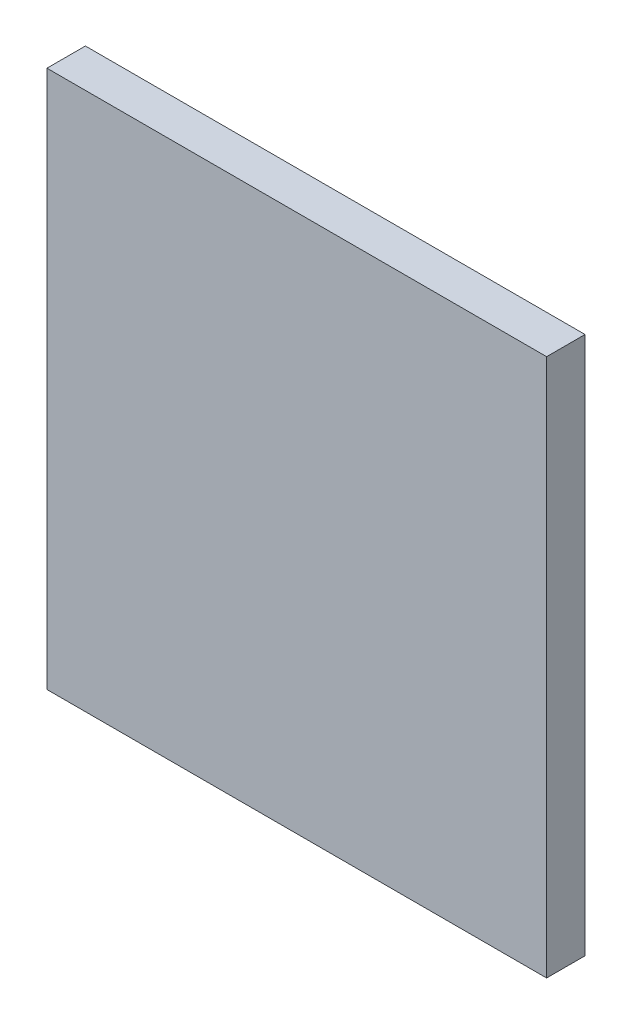
ISO-10303-21;
HEADER;
FILE_DESCRIPTION(('STEP AP214'),'2;1');
FILE_NAME('part.step','',(''),(''),'','','');
FILE_SCHEMA(('AUTOMOTIVE_DESIGN { 1 0 10303 214 1 1 1 1 }'));
ENDSEC;
DATA;
#1=APPLICATION_CONTEXT('core data for automotive mechanical design processes');
#2=APPLICATION_PROTOCOL_DEFINITION('international standard','automotive_design',2000,#1);
#3=PRODUCT_CONTEXT('',#1,'mechanical');
#4=PRODUCT('Part','Part','',(#3));
#5=PRODUCT_RELATED_PRODUCT_CATEGORY('part','',(#4));
#6=PRODUCT_DEFINITION_FORMATION('','',#4);
#7=PRODUCT_DEFINITION_CONTEXT('part definition',#1,'design');
#8=PRODUCT_DEFINITION('design','',#6,#7);
#9=PRODUCT_DEFINITION_SHAPE('','',#8);
#10=(LENGTH_UNIT() NAMED_UNIT(*) SI_UNIT(.MILLI.,.METRE.));
#11=(NAMED_UNIT(*) PLANE_ANGLE_UNIT() SI_UNIT($,.RADIAN.));
#12=(NAMED_UNIT(*) SI_UNIT($,.STERADIAN.) SOLID_ANGLE_UNIT());
#13=UNCERTAINTY_MEASURE_WITH_UNIT(LENGTH_MEASURE(1.E-05),#10,'distance_accuracy_value','');
#14=(GEOMETRIC_REPRESENTATION_CONTEXT(3) GLOBAL_UNCERTAINTY_ASSIGNED_CONTEXT((#13)) GLOBAL_UNIT_ASSIGNED_CONTEXT((#10,
#11,#12)) REPRESENTATION_CONTEXT('',''));
#15=CARTESIAN_POINT('',(0.,0.,0.));
#16=DIRECTION('',(0.,0.,1.));
#17=DIRECTION('',(1.,0.,0.));
#18=AXIS2_PLACEMENT_3D('',#15,#16,#17);
#19=CARTESIAN_POINT('',(-29.238417456991,23.8563829787234,5.));
#20=DIRECTION('',(1.,0.,0.));
#21=DIRECTION('',(0.,1.,0.));
#22=AXIS2_PLACEMENT_3D('',#19,#20,#21);
#23=PLANE('',#22);
#24=DIRECTION('',(0.,-1.,0.));
#25=VECTOR('',#24,1.);
#26=CARTESIAN_POINT('',(-29.238417456991,23.8563829787234,0.));
#27=LINE('',#26,#25);
#28=CARTESIAN_POINT('',(-29.238417456991,23.8563829787234,0.));
#29=VERTEX_POINT('',#28);
#30=CARTESIAN_POINT('',(-29.238417456991,-46.1436170212766,0.));
#31=VERTEX_POINT('',#30);
#32=EDGE_CURVE('E97',#29,#31,#27,.T.);
#33=ORIENTED_EDGE('',*,*,#32,.T.);
#34=DIRECTION('',(0.,0.,-1.));
#35=VECTOR('',#34,1.);
#36=CARTESIAN_POINT('',(-29.238417456991,-46.1436170212766,5.));
#37=LINE('',#36,#35);
#38=CARTESIAN_POINT('',(-29.238417456991,-46.1436170212766,5.));
#39=VERTEX_POINT('',#38);
#40=EDGE_CURVE('E11',#39,#31,#37,.T.);
#41=ORIENTED_EDGE('',*,*,#40,.F.);
#42=DIRECTION('',(0.,-1.,0.));
#43=VECTOR('',#42,1.);
#44=CARTESIAN_POINT('',(-29.238417456991,23.8563829787234,5.));
#45=LINE('',#44,#43);
#46=CARTESIAN_POINT('',(-29.238417456991,23.8563829787234,5.));
#47=VERTEX_POINT('',#46);
#48=EDGE_CURVE('E85',#47,#39,#45,.T.);
#49=ORIENTED_EDGE('',*,*,#48,.F.);
#50=DIRECTION('',(0.,0.,-1.));
#51=VECTOR('',#50,1.);
#52=CARTESIAN_POINT('',(-29.238417456991,23.8563829787234,5.));
#53=LINE('',#52,#51);
#54=EDGE_CURVE('E93',#47,#29,#53,.T.);
#55=ORIENTED_EDGE('',*,*,#54,.T.);
#56=EDGE_LOOP('',(#33,#41,#49,#55));
#57=FACE_BOUND('',#56,.T.);
#58=ADVANCED_FACE('F34',(#57),#23,.F.);
#59=CARTESIAN_POINT('',(-29.238417456991,-46.1436170212766,5.));
#60=DIRECTION('',(0.,1.,0.));
#61=DIRECTION('',(0.,0.,1.));
#62=AXIS2_PLACEMENT_3D('',#59,#60,#61);
#63=PLANE('',#62);
#64=DIRECTION('',(1.,0.,0.));
#65=VECTOR('',#64,1.);
#66=CARTESIAN_POINT('',(-29.238417456991,-46.1436170212766,0.));
#67=LINE('',#66,#65);
#68=CARTESIAN_POINT('',(35.761582543009,-46.1436170212766,0.));
#69=VERTEX_POINT('',#68);
#70=EDGE_CURVE('E89',#31,#69,#67,.T.);
#71=ORIENTED_EDGE('',*,*,#70,.T.);
#72=DIRECTION('',(0.,0.,-1.));
#73=VECTOR('',#72,1.);
#74=CARTESIAN_POINT('',(35.761582543009,-46.1436170212766,5.));
#75=LINE('',#74,#73);
#76=CARTESIAN_POINT('',(35.761582543009,-46.1436170212766,5.));
#77=VERTEX_POINT('',#76);
#78=EDGE_CURVE('E42',#77,#69,#75,.T.);
#79=ORIENTED_EDGE('',*,*,#78,.F.);
#80=DIRECTION('',(1.,0.,0.));
#81=VECTOR('',#80,1.);
#82=CARTESIAN_POINT('',(-29.238417456991,-46.1436170212766,5.));
#83=LINE('',#82,#81);
#84=EDGE_CURVE('E80',#39,#77,#83,.T.);
#85=ORIENTED_EDGE('',*,*,#84,.F.);
#86=ORIENTED_EDGE('',*,*,#40,.T.);
#87=EDGE_LOOP('',(#71,#79,#85,#86));
#88=FACE_BOUND('',#87,.T.);
#89=ADVANCED_FACE('F88',(#88),#63,.F.);
#90=CARTESIAN_POINT('',(35.761582543009,23.8563829787234,5.));
#91=DIRECTION('',(-1.,0.,0.));
#92=DIRECTION('',(0.,-1.,0.));
#93=AXIS2_PLACEMENT_3D('',#90,#91,#92);
#94=PLANE('',#93);
#95=DIRECTION('',(0.,1.,0.));
#96=VECTOR('',#95,1.);
#97=CARTESIAN_POINT('',(35.761582543009,23.8563829787234,0.));
#98=LINE('',#97,#96);
#99=CARTESIAN_POINT('',(35.761582543009,23.8563829787234,0.));
#100=VERTEX_POINT('',#99);
#101=EDGE_CURVE('E67',#69,#100,#98,.T.);
#102=ORIENTED_EDGE('',*,*,#101,.T.);
#103=DIRECTION('',(0.,0.,-1.));
#104=VECTOR('',#103,1.);
#105=CARTESIAN_POINT('',(35.761582543009,23.8563829787234,5.));
#106=LINE('',#105,#104);
#107=CARTESIAN_POINT('',(35.761582543009,23.8563829787234,5.));
#108=VERTEX_POINT('',#107);
#109=EDGE_CURVE('E90',#108,#100,#106,.T.);
#110=ORIENTED_EDGE('',*,*,#109,.F.);
#111=DIRECTION('',(0.,1.,0.));
#112=VECTOR('',#111,1.);
#113=CARTESIAN_POINT('',(35.761582543009,23.8563829787234,5.));
#114=LINE('',#113,#112);
#115=EDGE_CURVE('E83',#77,#108,#114,.T.);
#116=ORIENTED_EDGE('',*,*,#115,.F.);
#117=ORIENTED_EDGE('',*,*,#78,.T.);
#118=EDGE_LOOP('',(#102,#110,#116,#117));
#119=FACE_BOUND('',#118,.T.);
#120=ADVANCED_FACE('F91',(#119),#94,.F.);
#121=CARTESIAN_POINT('',(-29.238417456991,23.8563829787234,5.));
#122=DIRECTION('',(0.,-1.,0.));
#123=DIRECTION('',(0.,0.,-1.));
#124=AXIS2_PLACEMENT_3D('',#121,#122,#123);
#125=PLANE('',#124);
#126=DIRECTION('',(-1.,0.,0.));
#127=VECTOR('',#126,1.);
#128=CARTESIAN_POINT('',(-29.238417456991,23.8563829787234,0.));
#129=LINE('',#128,#127);
#130=EDGE_CURVE('E73',#100,#29,#129,.T.);
#131=ORIENTED_EDGE('',*,*,#130,.T.);
#132=ORIENTED_EDGE('',*,*,#54,.F.);
#133=DIRECTION('',(-1.,0.,0.));
#134=VECTOR('',#133,1.);
#135=CARTESIAN_POINT('',(-29.238417456991,23.8563829787234,5.));
#136=LINE('',#135,#134);
#137=EDGE_CURVE('E50',#108,#47,#136,.T.);
#138=ORIENTED_EDGE('',*,*,#137,.F.);
#139=ORIENTED_EDGE('',*,*,#109,.T.);
#140=EDGE_LOOP('',(#131,#132,#138,#139));
#141=FACE_BOUND('',#140,.T.);
#142=ADVANCED_FACE('F104',(#141),#125,.F.);
#143=CARTESIAN_POINT('',(0.,0.,5.));
#144=DIRECTION('',(0.,0.,1.));
#145=DIRECTION('',(1.,0.,0.));
#146=AXIS2_PLACEMENT_3D('',#143,#144,#145);
#147=PLANE('',#146);
#148=ORIENTED_EDGE('',*,*,#48,.T.);
#149=ORIENTED_EDGE('',*,*,#84,.T.);
#150=ORIENTED_EDGE('',*,*,#115,.T.);
#151=ORIENTED_EDGE('',*,*,#137,.T.);
#152=EDGE_LOOP('',(#148,#149,#150,#151));
#153=FACE_BOUND('',#152,.T.);
#154=ADVANCED_FACE('F81',(#153),#147,.T.);
#155=CARTESIAN_POINT('',(0.,0.,0.));
#156=DIRECTION('',(0.,0.,1.));
#157=DIRECTION('',(1.,0.,0.));
#158=AXIS2_PLACEMENT_3D('',#155,#156,#157);
#159=PLANE('',#158);
#160=ORIENTED_EDGE('',*,*,#32,.F.);
#161=ORIENTED_EDGE('',*,*,#130,.F.);
#162=ORIENTED_EDGE('',*,*,#101,.F.);
#163=ORIENTED_EDGE('',*,*,#70,.F.);
#164=EDGE_LOOP('',(#160,#161,#162,#163));
#165=FACE_BOUND('',#164,.T.);
#166=ADVANCED_FACE('F107',(#165),#159,.F.);
#167=CLOSED_SHELL('',(#58,#89,#120,#142,#154,#166));
#168=MANIFOLD_SOLID_BREP('B2',#167);
#169=ADVANCED_BREP_SHAPE_REPRESENTATION('',(#18,#168),#14);
#170=SHAPE_DEFINITION_REPRESENTATION(#9,#169);
ENDSEC;
END-ISO-10303-21;
